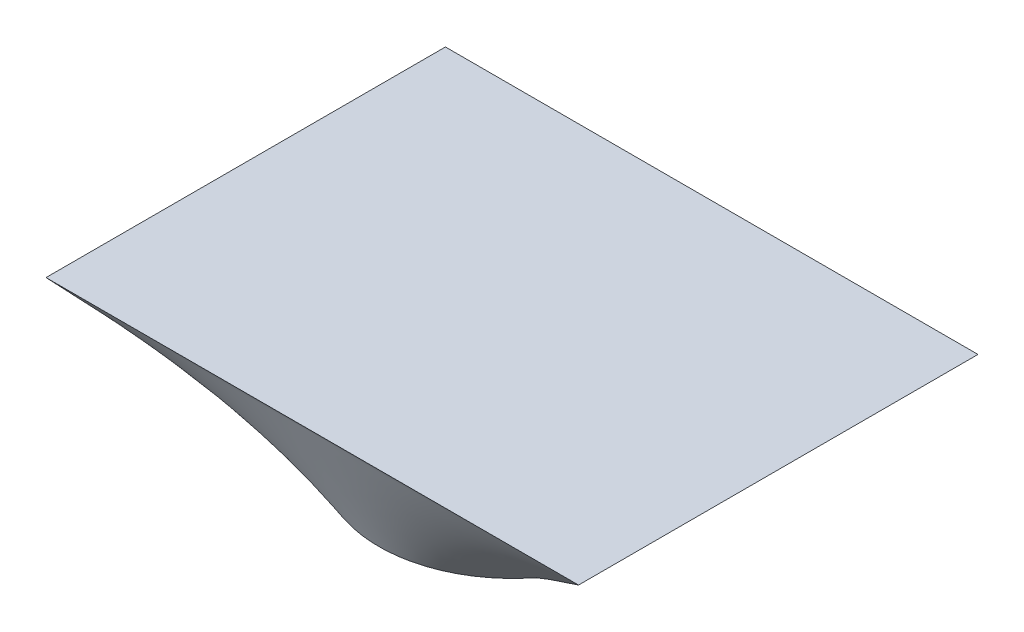
ISO-10303-21;
HEADER;
FILE_DESCRIPTION(('STEP AP214'),'2;1');
FILE_NAME('part.step','',(''),(''),'','','');
FILE_SCHEMA(('AUTOMOTIVE_DESIGN { 1 0 10303 214 1 1 1 1 }'));
ENDSEC;
DATA;
#1=APPLICATION_CONTEXT('core data for automotive mechanical design processes');
#2=APPLICATION_PROTOCOL_DEFINITION('international standard','automotive_design',2000,#1);
#3=PRODUCT_CONTEXT('',#1,'mechanical');
#4=PRODUCT('Part','Part','',(#3));
#5=PRODUCT_RELATED_PRODUCT_CATEGORY('part','',(#4));
#6=PRODUCT_DEFINITION_FORMATION('','',#4);
#7=PRODUCT_DEFINITION_CONTEXT('part definition',#1,'design');
#8=PRODUCT_DEFINITION('design','',#6,#7);
#9=PRODUCT_DEFINITION_SHAPE('','',#8);
#10=(LENGTH_UNIT() NAMED_UNIT(*) SI_UNIT(.MILLI.,.METRE.));
#11=(NAMED_UNIT(*) PLANE_ANGLE_UNIT() SI_UNIT($,.RADIAN.));
#12=(NAMED_UNIT(*) SI_UNIT($,.STERADIAN.) SOLID_ANGLE_UNIT());
#13=UNCERTAINTY_MEASURE_WITH_UNIT(LENGTH_MEASURE(1.E-05),#10,'distance_accuracy_value','');
#14=(GEOMETRIC_REPRESENTATION_CONTEXT(3) GLOBAL_UNCERTAINTY_ASSIGNED_CONTEXT((#13)) GLOBAL_UNIT_ASSIGNED_CONTEXT((#10,
#11,#12)) REPRESENTATION_CONTEXT('',''));
#15=CARTESIAN_POINT('',(0.,0.,0.));
#16=DIRECTION('',(0.,0.,1.));
#17=DIRECTION('',(1.,0.,0.));
#18=AXIS2_PLACEMENT_3D('',#15,#16,#17);
#19=CARTESIAN_POINT('',(0.,100.,0.));
#20=DIRECTION('',(0.,1.,0.));
#21=DIRECTION('',(0.,0.,1.));
#22=AXIS2_PLACEMENT_3D('',#19,#20,#21);
#23=PLANE('',#22);
#24=DIRECTION('',(0.,0.,1.));
#25=VECTOR('',#24,1.);
#26=CARTESIAN_POINT('',(-200.,100.,150.));
#27=LINE('',#26,#25);
#28=CARTESIAN_POINT('',(-200.,100.,-150.));
#29=VERTEX_POINT('',#28);
#30=CARTESIAN_POINT('',(-200.,100.,150.));
#31=VERTEX_POINT('',#30);
#32=EDGE_CURVE('E108',#29,#31,#27,.T.);
#33=ORIENTED_EDGE('',*,*,#32,.T.);
#34=DIRECTION('',(1.,0.,0.));
#35=VECTOR('',#34,1.);
#36=CARTESIAN_POINT('',(200.,100.,150.));
#37=LINE('',#36,#35);
#38=CARTESIAN_POINT('',(200.,100.,150.));
#39=VERTEX_POINT('',#38);
#40=EDGE_CURVE('E101',#31,#39,#37,.T.);
#41=ORIENTED_EDGE('',*,*,#40,.T.);
#42=DIRECTION('',(0.,0.,-1.));
#43=VECTOR('',#42,1.);
#44=CARTESIAN_POINT('',(200.,100.,150.));
#45=LINE('',#44,#43);
#46=CARTESIAN_POINT('',(200.,100.,-150.));
#47=VERTEX_POINT('',#46);
#48=EDGE_CURVE('E122',#39,#47,#45,.T.);
#49=ORIENTED_EDGE('',*,*,#48,.T.);
#50=DIRECTION('',(-1.,0.,0.));
#51=VECTOR('',#50,1.);
#52=CARTESIAN_POINT('',(200.,100.,-150.));
#53=LINE('',#52,#51);
#54=EDGE_CURVE('E127',#47,#29,#53,.T.);
#55=ORIENTED_EDGE('',*,*,#54,.T.);
#56=EDGE_LOOP('',(#33,#41,#49,#55));
#57=FACE_BOUND('',#56,.T.);
#58=ADVANCED_FACE('F63',(#57),#23,.T.);
#59=CARTESIAN_POINT('',(0.,0.,0.));
#60=DIRECTION('',(0.,1.,0.));
#61=DIRECTION('',(0.,0.,1.));
#62=AXIS2_PLACEMENT_3D('',#59,#60,#61);
#63=PLANE('',#62);
#64=CARTESIAN_POINT('',(0.,0.,0.));
#65=DIRECTION('',(0.,1.,0.));
#66=DIRECTION('',(0.,0.,1.));
#67=AXIS2_PLACEMENT_3D('',#64,#65,#66);
#68=CIRCLE('',#67,100.);
#69=CARTESIAN_POINT('',(-80.,0.,-60.));
#70=VERTEX_POINT('',#69);
#71=CARTESIAN_POINT('',(-80.,0.,60.));
#72=VERTEX_POINT('',#71);
#73=EDGE_CURVE('E12',#70,#72,#68,.T.);
#74=ORIENTED_EDGE('',*,*,#73,.F.);
#75=CARTESIAN_POINT('',(80.,0.,-60.));
#76=VERTEX_POINT('',#75);
#77=EDGE_CURVE('E113',#76,#70,#68,.T.);
#78=ORIENTED_EDGE('',*,*,#77,.F.);
#79=CARTESIAN_POINT('',(80.,0.,60.));
#80=VERTEX_POINT('',#79);
#81=EDGE_CURVE('E189',#80,#76,#68,.T.);
#82=ORIENTED_EDGE('',*,*,#81,.F.);
#83=EDGE_CURVE('E74',#72,#80,#68,.T.);
#84=ORIENTED_EDGE('',*,*,#83,.F.);
#85=EDGE_LOOP('',(#74,#78,#82,#84));
#86=FACE_BOUND('',#85,.T.);
#87=ADVANCED_FACE('F157',(#86),#63,.F.);
#88=CARTESIAN_POINT('',(-80.,0.,-60.));
#89=CARTESIAN_POINT('',(-200.,100.,-150.));
#90=CARTESIAN_POINT('',(-83.,0.,-56.));
#91=CARTESIAN_POINT('',(-200.,100.,-137.5));
#92=CARTESIAN_POINT('',(-85.7747020376778,0.,-51.6724336793541));
#93=CARTESIAN_POINT('',(-200.,100.,-125.));
#94=CARTESIAN_POINT('',(-90.6958861976163,0.,-42.4452133794695));
#95=CARTESIAN_POINT('',(-200.,100.,-100.));
#96=CARTESIAN_POINT('',(-92.8414901387874,0.,-37.54565376187));
#97=CARTESIAN_POINT('',(-200.,100.,-87.5));
#98=CARTESIAN_POINT('',(-96.3476990504017,0.,-27.3192111029949));
#99=CARTESIAN_POINT('',(-200.,100.,-62.5));
#100=CARTESIAN_POINT('',(-97.7074910820452,0.,-21.9928656361475));
#101=CARTESIAN_POINT('',(-200.,100.,-50.));
#102=CARTESIAN_POINT('',(-99.5338882282997,0.,-11.1105826397146));
#103=CARTESIAN_POINT('',(-200.,100.,-25.));
#104=CARTESIAN_POINT('',(-100.,0.,-5.55555555555558));
#105=CARTESIAN_POINT('',(-200.,100.,-12.5));
#106=CARTESIAN_POINT('',(-100.,0.,5.55555555555553));
#107=CARTESIAN_POINT('',(-200.,100.,12.5));
#108=CARTESIAN_POINT('',(-99.5338882282997,0.,11.1105826397146));
#109=CARTESIAN_POINT('',(-200.,100.,25.));
#110=CARTESIAN_POINT('',(-97.7074910820452,0.,21.9928656361474));
#111=CARTESIAN_POINT('',(-200.,100.,50.));
#112=CARTESIAN_POINT('',(-96.3476990504017,0.,27.3192111029949));
#113=CARTESIAN_POINT('',(-200.,100.,62.5));
#114=CARTESIAN_POINT('',(-92.8414901387874,0.,37.54565376187));
#115=CARTESIAN_POINT('',(-200.,100.,87.5));
#116=CARTESIAN_POINT('',(-90.6958861976163,0.,42.4452133794694));
#117=CARTESIAN_POINT('',(-200.,100.,100.));
#118=CARTESIAN_POINT('',(-85.7747020376778,0.,51.6724336793541));
#119=CARTESIAN_POINT('',(-200.,100.,125.));
#120=CARTESIAN_POINT('',(-83.,0.,56.));
#121=CARTESIAN_POINT('',(-200.,100.,137.5));
#122=CARTESIAN_POINT('',(-80.,0.,60.));
#123=CARTESIAN_POINT('',(-200.,100.,150.));
#124=B_SPLINE_SURFACE_WITH_KNOTS('',3,1,((#88,#89),(#90,#91),(#92,#93),(#94,#95),(#96,#97),(#98,
#99),(#100,#101),(#102,#103),(#104,#105),(#106,#107),(#108,#109),(#110,#111),(#112,#113),(#114,
#115),(#116,#117),(#118,#119),(#120,#121),(#122,#123)),.UNSPECIFIED.,.F.,.F.,.F.,(4,2,2,2,2,2,2,
2,4),(2,2),(0.,0.125,0.25,0.375,0.5,0.625,0.75,0.875,1.),(0.,1.),.UNSPECIFIED.);
#125=DIRECTION('',(-0.665640235470275,0.554700196225229,0.499230176602706));
#126=VECTOR('',#125,1.);
#127=CARTESIAN_POINT('',(-140.,50.,105.));
#128=LINE('',#127,#126);
#129=EDGE_CURVE('E83',#72,#31,#128,.T.);
#130=DIRECTION('',(0.665640235470275,-0.554700196225229,0.499230176602706));
#131=VECTOR('',#130,1.);
#132=CARTESIAN_POINT('',(-140.,50.,-105.));
#133=LINE('',#132,#131);
#134=EDGE_CURVE('E114',#29,#70,#133,.T.);
#135=ORIENTED_EDGE('',*,*,#73,.T.);
#136=ORIENTED_EDGE('',*,*,#129,.T.);
#137=ORIENTED_EDGE('',*,*,#32,.F.);
#138=ORIENTED_EDGE('',*,*,#134,.T.);
#139=EDGE_LOOP('',(#135,#136,#137,#138));
#140=FACE_BOUND('',#139,.T.);
#141=ADVANCED_FACE('F106',(#140),#124,.T.);
#142=CARTESIAN_POINT('',(-80.,0.,60.));
#143=CARTESIAN_POINT('',(-200.,100.,150.));
#144=CARTESIAN_POINT('',(-78.,0.,62.6666666666667));
#145=CARTESIAN_POINT('',(-191.666666666667,100.,150.));
#146=CARTESIAN_POINT('',(-75.8161784466541,0.,65.3003672847801));
#147=CARTESIAN_POINT('',(-183.333333333333,100.,150.));
#148=CARTESIAN_POINT('',(-71.0690674549852,0.,70.4373376332527));
#149=CARTESIAN_POINT('',(-166.666666666667,100.,150.));
#150=CARTESIAN_POINT('',(-68.5056608494402,0.,72.9405141677613));
#151=CARTESIAN_POINT('',(-158.333333333333,100.,150.));
#152=CARTESIAN_POINT('',(-63.0011884656284,0.,77.744417339088));
#153=CARTESIAN_POINT('',(-141.666666666667,100.,150.));
#154=CARTESIAN_POINT('',(-60.0600296348831,0.,80.0450011186957));
#155=CARTESIAN_POINT('',(-133.333333333333,100.,150.));
#156=CARTESIAN_POINT('',(-53.8189739238358,0.,84.3678102692046));
#157=CARTESIAN_POINT('',(-116.666666666666,100.,150.));
#158=CARTESIAN_POINT('',(-50.5190311418685,0.,86.3898500576701));
#159=CARTESIAN_POINT('',(-108.333333333333,100.,150.));
#160=CARTESIAN_POINT('',(-43.598615916955,0.,90.080738177624));
#161=CARTESIAN_POINT('',(-91.6666666666663,100.,150.));
#162=CARTESIAN_POINT('',(-39.9781654206717,0.,91.749377002492));
#163=CARTESIAN_POINT('',(-83.333333333333,100.,150.));
#164=CARTESIAN_POINT('',(-32.4746647680076,0.,94.6657173371307));
#165=CARTESIAN_POINT('',(-66.6666666666663,100.,150.));
#166=CARTESIAN_POINT('',(-28.5917159763314,0.,95.913214990138));
#167=CARTESIAN_POINT('',(-58.3333333333329,100.,150.));
#168=CARTESIAN_POINT('',(-20.6390532544379,0.,97.9329388560158));
#169=CARTESIAN_POINT('',(-41.6666666666662,100.,150.));
#170=CARTESIAN_POINT('',(-16.5695165710306,0.,98.7050018420667));
#171=CARTESIAN_POINT('',(-33.3333333333329,100.,150.));
#172=CARTESIAN_POINT('',(-8.33320716437797,0.,99.7385779244702));
#173=CARTESIAN_POINT('',(-16.6666666666662,100.,150.));
#174=CARTESIAN_POINT('',(-4.16666666666668,0.,100.));
#175=CARTESIAN_POINT('',(-8.33333333333283,100.,150.));
#176=CARTESIAN_POINT('',(4.16666666666667,0.,100.));
#177=CARTESIAN_POINT('',(8.33333333333386,100.,150.));
#178=CARTESIAN_POINT('',(8.33320716437795,0.,99.7385779244702));
#179=CARTESIAN_POINT('',(16.6666666666672,100.,150.));
#180=CARTESIAN_POINT('',(16.5695165710306,0.,98.7050018420667));
#181=CARTESIAN_POINT('',(33.3333333333339,100.,150.));
#182=CARTESIAN_POINT('',(20.6390532544379,0.,97.9329388560158));
#183=CARTESIAN_POINT('',(41.6666666666672,100.,150.));
#184=CARTESIAN_POINT('',(28.5917159763314,0.,95.9132149901381));
#185=CARTESIAN_POINT('',(58.3333333333338,100.,150.));
#186=CARTESIAN_POINT('',(32.4746647680076,0.,94.6657173371306));
#187=CARTESIAN_POINT('',(66.6666666666672,100.,150.));
#188=CARTESIAN_POINT('',(39.9781654206717,0.,91.749377002492));
#189=CARTESIAN_POINT('',(83.3333333333338,100.,150.));
#190=CARTESIAN_POINT('',(43.598615916955,0.,90.080738177624));
#191=CARTESIAN_POINT('',(91.6666666666671,100.,150.));
#192=CARTESIAN_POINT('',(50.5190311418685,0.,86.3898500576702));
#193=CARTESIAN_POINT('',(108.333333333334,100.,150.));
#194=CARTESIAN_POINT('',(53.8189739238358,0.,84.3678102692046));
#195=CARTESIAN_POINT('',(116.666666666667,100.,150.));
#196=CARTESIAN_POINT('',(60.0600296348831,0.,80.0450011186957));
#197=CARTESIAN_POINT('',(133.333333333334,100.,150.));
#198=CARTESIAN_POINT('',(63.0011884656283,0.,77.744417339088));
#199=CARTESIAN_POINT('',(141.666666666667,100.,150.));
#200=CARTESIAN_POINT('',(68.5056608494402,0.,72.9405141677613));
#201=CARTESIAN_POINT('',(158.333333333333,100.,150.));
#202=CARTESIAN_POINT('',(71.0690674549852,0.,70.4373376332527));
#203=CARTESIAN_POINT('',(166.666666666667,100.,150.));
#204=CARTESIAN_POINT('',(75.8161784466541,0.,65.3003672847801));
#205=CARTESIAN_POINT('',(183.333333333333,100.,150.));
#206=CARTESIAN_POINT('',(78.,0.,62.6666666666667));
#207=CARTESIAN_POINT('',(191.666666666667,100.,150.));
#208=CARTESIAN_POINT('',(80.,0.,60.));
#209=CARTESIAN_POINT('',(200.,100.,150.));
#210=B_SPLINE_SURFACE_WITH_KNOTS('',3,1,((#142,#143),(#144,#145),(#146,#147),(#148,#149),(#150,
#151),(#152,#153),(#154,#155),(#156,#157),(#158,#159),(#160,#161),(#162,#163),(#164,#165),(#166,
#167),(#168,#169),(#170,#171),(#172,#173),(#174,#175),(#176,#177),(#178,#179),(#180,#181),(#182,
#183),(#184,#185),(#186,#187),(#188,#189),(#190,#191),(#192,#193),(#194,#195),(#196,#197),(#198,
#199),(#200,#201),(#202,#203),(#204,#205),(#206,#207),(#208,#209)),.UNSPECIFIED.,.F.,.F.,.F.,(4,
2,2,2,2,2,2,2,2,2,2,2,2,2,2,2,4),(2,2),(0.,0.0624999999999999,0.125,0.1875,0.25,0.3125,0.375,
0.4375,0.5,0.5625,0.625,0.6875,0.75,0.8125,0.875,0.9375,1.),(0.,1.),.UNSPECIFIED.);
#211=DIRECTION('',(0.665640235470275,0.554700196225229,0.499230176602706));
#212=VECTOR('',#211,1.);
#213=CARTESIAN_POINT('',(140.,50.,105.));
#214=LINE('',#213,#212);
#215=EDGE_CURVE('E120',#80,#39,#214,.T.);
#216=ORIENTED_EDGE('',*,*,#83,.T.);
#217=ORIENTED_EDGE('',*,*,#215,.T.);
#218=ORIENTED_EDGE('',*,*,#40,.F.);
#219=ORIENTED_EDGE('',*,*,#129,.F.);
#220=EDGE_LOOP('',(#216,#217,#218,#219));
#221=FACE_BOUND('',#220,.T.);
#222=ADVANCED_FACE('F118',(#221),#210,.T.);
#223=CARTESIAN_POINT('',(80.,0.,-60.));
#224=CARTESIAN_POINT('',(200.,100.,-150.));
#225=CARTESIAN_POINT('',(78.,0.,-62.6666666666667));
#226=CARTESIAN_POINT('',(191.666666666667,100.,-150.));
#227=CARTESIAN_POINT('',(75.8161784466541,0.,-65.3003672847801));
#228=CARTESIAN_POINT('',(183.333333333333,100.,-150.));
#229=CARTESIAN_POINT('',(71.0690674549852,0.,-70.4373376332527));
#230=CARTESIAN_POINT('',(166.666666666667,100.,-150.));
#231=CARTESIAN_POINT('',(68.5056608494402,0.,-72.9405141677613));
#232=CARTESIAN_POINT('',(158.333333333333,100.,-150.));
#233=CARTESIAN_POINT('',(63.0011884656283,0.,-77.744417339088));
#234=CARTESIAN_POINT('',(141.666666666667,100.,-150.));
#235=CARTESIAN_POINT('',(60.060029634883,0.,-80.0450011186957));
#236=CARTESIAN_POINT('',(133.333333333333,100.,-150.));
#237=CARTESIAN_POINT('',(53.8189739238358,0.,-84.3678102692046));
#238=CARTESIAN_POINT('',(116.666666666667,100.,-150.));
#239=CARTESIAN_POINT('',(50.5190311418685,0.,-86.3898500576701));
#240=CARTESIAN_POINT('',(108.333333333333,100.,-150.));
#241=CARTESIAN_POINT('',(43.598615916955,0.,-90.080738177624));
#242=CARTESIAN_POINT('',(91.6666666666665,100.,-150.));
#243=CARTESIAN_POINT('',(39.9781654206717,0.,-91.749377002492));
#244=CARTESIAN_POINT('',(83.3333333333332,100.,-150.));
#245=CARTESIAN_POINT('',(32.4746647680076,0.,-94.6657173371307));
#246=CARTESIAN_POINT('',(66.6666666666665,100.,-150.));
#247=CARTESIAN_POINT('',(28.5917159763314,0.,-95.9132149901381));
#248=CARTESIAN_POINT('',(58.3333333333331,100.,-150.));
#249=CARTESIAN_POINT('',(20.6390532544379,0.,-97.9329388560158));
#250=CARTESIAN_POINT('',(41.6666666666665,100.,-150.));
#251=CARTESIAN_POINT('',(16.5695165710306,0.,-98.7050018420667));
#252=CARTESIAN_POINT('',(33.3333333333331,100.,-150.));
#253=CARTESIAN_POINT('',(8.33320716437797,0.,-99.7385779244702));
#254=CARTESIAN_POINT('',(16.6666666666665,100.,-150.));
#255=CARTESIAN_POINT('',(4.16666666666667,0.,-100.));
#256=CARTESIAN_POINT('',(8.33333333333312,100.,-150.));
#257=CARTESIAN_POINT('',(-4.16666666666666,0.,-100.));
#258=CARTESIAN_POINT('',(-8.33333333333355,100.,-150.));
#259=CARTESIAN_POINT('',(-8.33320716437795,0.,-99.7385779244702));
#260=CARTESIAN_POINT('',(-16.6666666666669,100.,-150.));
#261=CARTESIAN_POINT('',(-16.5695165710306,0.,-98.7050018420668));
#262=CARTESIAN_POINT('',(-33.3333333333335,100.,-150.));
#263=CARTESIAN_POINT('',(-20.6390532544379,0.,-97.9329388560158));
#264=CARTESIAN_POINT('',(-41.6666666666669,100.,-150.));
#265=CARTESIAN_POINT('',(-28.5917159763314,0.,-95.9132149901381));
#266=CARTESIAN_POINT('',(-58.3333333333335,100.,-150.));
#267=CARTESIAN_POINT('',(-32.4746647680076,0.,-94.6657173371307));
#268=CARTESIAN_POINT('',(-66.6666666666669,100.,-150.));
#269=CARTESIAN_POINT('',(-39.9781654206716,0.,-91.749377002492));
#270=CARTESIAN_POINT('',(-83.3333333333335,100.,-150.));
#271=CARTESIAN_POINT('',(-43.598615916955,0.,-90.080738177624));
#272=CARTESIAN_POINT('',(-91.6666666666669,100.,-150.));
#273=CARTESIAN_POINT('',(-50.5190311418685,0.,-86.3898500576702));
#274=CARTESIAN_POINT('',(-108.333333333334,100.,-150.));
#275=CARTESIAN_POINT('',(-53.8189739238358,0.,-84.3678102692046));
#276=CARTESIAN_POINT('',(-116.666666666667,100.,-150.));
#277=CARTESIAN_POINT('',(-60.060029634883,0.,-80.0450011186958));
#278=CARTESIAN_POINT('',(-133.333333333334,100.,-150.));
#279=CARTESIAN_POINT('',(-63.0011884656283,0.,-77.744417339088));
#280=CARTESIAN_POINT('',(-141.666666666667,100.,-150.));
#281=CARTESIAN_POINT('',(-68.5056608494401,0.,-72.9405141677613));
#282=CARTESIAN_POINT('',(-158.333333333333,100.,-150.));
#283=CARTESIAN_POINT('',(-71.0690674549852,0.,-70.4373376332527));
#284=CARTESIAN_POINT('',(-166.666666666667,100.,-150.));
#285=CARTESIAN_POINT('',(-75.8161784466541,0.,-65.3003672847801));
#286=CARTESIAN_POINT('',(-183.333333333333,100.,-150.));
#287=CARTESIAN_POINT('',(-78.,0.,-62.6666666666667));
#288=CARTESIAN_POINT('',(-191.666666666667,100.,-150.));
#289=CARTESIAN_POINT('',(-80.,0.,-60.));
#290=CARTESIAN_POINT('',(-200.,100.,-150.));
#291=B_SPLINE_SURFACE_WITH_KNOTS('',3,1,((#223,#224),(#225,#226),(#227,#228),(#229,#230),(#231,
#232),(#233,#234),(#235,#236),(#237,#238),(#239,#240),(#241,#242),(#243,#244),(#245,#246),(#247,
#248),(#249,#250),(#251,#252),(#253,#254),(#255,#256),(#257,#258),(#259,#260),(#261,#262),(#263,
#264),(#265,#266),(#267,#268),(#269,#270),(#271,#272),(#273,#274),(#275,#276),(#277,#278),(#279,
#280),(#281,#282),(#283,#284),(#285,#286),(#287,#288),(#289,#290)),.UNSPECIFIED.,.F.,.F.,.F.,(4,
2,2,2,2,2,2,2,2,2,2,2,2,2,2,2,4),(2,2),(0.,0.0624999999999999,0.125,0.1875,0.25,0.3125,0.375,
0.4375,0.5,0.5625,0.625,0.6875,0.75,0.8125,0.875,0.9375,1.),(0.,1.),.UNSPECIFIED.);
#292=DIRECTION('',(0.665640235470275,0.554700196225229,-0.499230176602706));
#293=VECTOR('',#292,1.);
#294=CARTESIAN_POINT('',(140.,50.,-105.));
#295=LINE('',#294,#293);
#296=EDGE_CURVE('E121',#76,#47,#295,.T.);
#297=ORIENTED_EDGE('',*,*,#77,.T.);
#298=ORIENTED_EDGE('',*,*,#134,.F.);
#299=ORIENTED_EDGE('',*,*,#54,.F.);
#300=ORIENTED_EDGE('',*,*,#296,.F.);
#301=EDGE_LOOP('',(#297,#298,#299,#300));
#302=FACE_BOUND('',#301,.T.);
#303=ADVANCED_FACE('F214',(#302),#291,.T.);
#304=CARTESIAN_POINT('',(80.,0.,60.));
#305=CARTESIAN_POINT('',(200.,100.,150.));
#306=CARTESIAN_POINT('',(83.,0.,56.));
#307=CARTESIAN_POINT('',(200.,100.,137.5));
#308=CARTESIAN_POINT('',(85.7747020376778,0.,51.6724336793541));
#309=CARTESIAN_POINT('',(200.,100.,125.));
#310=CARTESIAN_POINT('',(90.6958861976163,0.,42.4452133794694));
#311=CARTESIAN_POINT('',(200.,100.,100.));
#312=CARTESIAN_POINT('',(92.8414901387874,0.,37.54565376187));
#313=CARTESIAN_POINT('',(200.,100.,87.5000000000001));
#314=CARTESIAN_POINT('',(96.3476990504017,0.,27.3192111029949));
#315=CARTESIAN_POINT('',(200.,100.,62.5000000000001));
#316=CARTESIAN_POINT('',(97.7074910820452,0.,21.9928656361474));
#317=CARTESIAN_POINT('',(200.,100.,50.0000000000001));
#318=CARTESIAN_POINT('',(99.5338882282997,0.,11.1105826397146));
#319=CARTESIAN_POINT('',(200.,100.,25.0000000000001));
#320=CARTESIAN_POINT('',(100.,0.,5.55555555555555));
#321=CARTESIAN_POINT('',(200.,100.,12.5000000000001));
#322=CARTESIAN_POINT('',(100.,0.,-5.55555555555556));
#323=CARTESIAN_POINT('',(200.,100.,-12.4999999999999));
#324=CARTESIAN_POINT('',(99.5338882282996,0.,-11.1105826397146));
#325=CARTESIAN_POINT('',(200.,100.,-24.9999999999999));
#326=CARTESIAN_POINT('',(97.7074910820452,0.,-21.9928656361474));
#327=CARTESIAN_POINT('',(200.,100.,-49.9999999999999));
#328=CARTESIAN_POINT('',(96.3476990504017,0.,-27.3192111029949));
#329=CARTESIAN_POINT('',(200.,100.,-62.4999999999999));
#330=CARTESIAN_POINT('',(92.8414901387874,0.,-37.54565376187));
#331=CARTESIAN_POINT('',(200.,100.,-87.4999999999999));
#332=CARTESIAN_POINT('',(90.6958861976163,0.,-42.4452133794694));
#333=CARTESIAN_POINT('',(200.,100.,-99.9999999999999));
#334=CARTESIAN_POINT('',(85.7747020376779,0.,-51.6724336793541));
#335=CARTESIAN_POINT('',(200.,100.,-125.));
#336=CARTESIAN_POINT('',(83.,0.,-56.));
#337=CARTESIAN_POINT('',(200.,100.,-137.5));
#338=CARTESIAN_POINT('',(80.,0.,-60.));
#339=CARTESIAN_POINT('',(200.,100.,-150.));
#340=B_SPLINE_SURFACE_WITH_KNOTS('',3,1,((#304,#305),(#306,#307),(#308,#309),(#310,#311),(#312,
#313),(#314,#315),(#316,#317),(#318,#319),(#320,#321),(#322,#323),(#324,#325),(#326,#327),(#328,
#329),(#330,#331),(#332,#333),(#334,#335),(#336,#337),(#338,#339)),.UNSPECIFIED.,.F.,.F.,.F.,(4,
2,2,2,2,2,2,2,4),(2,2),(0.,0.125,0.25,0.375,0.5,0.625,0.75,0.875,1.),(0.,1.),.UNSPECIFIED.);
#341=ORIENTED_EDGE('',*,*,#81,.T.);
#342=ORIENTED_EDGE('',*,*,#296,.T.);
#343=ORIENTED_EDGE('',*,*,#48,.F.);
#344=ORIENTED_EDGE('',*,*,#215,.F.);
#345=EDGE_LOOP('',(#341,#342,#343,#344));
#346=FACE_BOUND('',#345,.T.);
#347=ADVANCED_FACE('F205',(#346),#340,.T.);
#348=CLOSED_SHELL('',(#58,#87,#141,#222,#303,#347));
#349=MANIFOLD_SOLID_BREP('B2',#348);
#350=ADVANCED_BREP_SHAPE_REPRESENTATION('',(#18,#349),#14);
#351=SHAPE_DEFINITION_REPRESENTATION(#9,#350);
ENDSEC;
END-ISO-10303-21;
